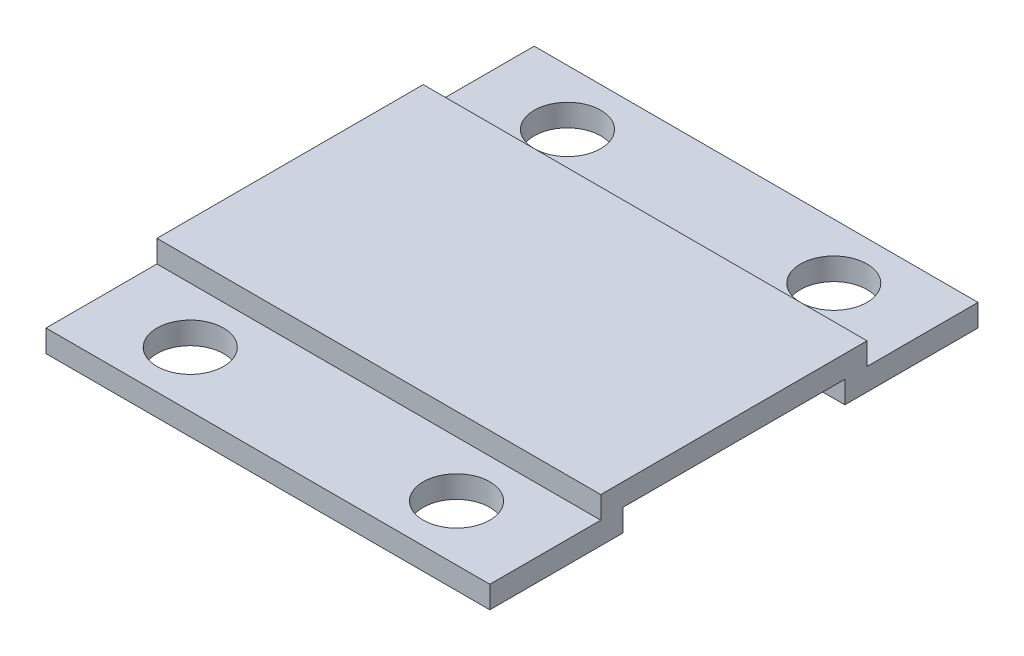
ISO-10303-21;
HEADER;
FILE_DESCRIPTION(('STEP AP214'),'2;1');
FILE_NAME('part.step','',(''),(''),'','','');
FILE_SCHEMA(('AUTOMOTIVE_DESIGN { 1 0 10303 214 1 1 1 1 }'));
ENDSEC;
DATA;
#1=APPLICATION_CONTEXT('core data for automotive mechanical design processes');
#2=APPLICATION_PROTOCOL_DEFINITION('international standard','automotive_design',2000,#1);
#3=PRODUCT_CONTEXT('',#1,'mechanical');
#4=PRODUCT('Part','Part','',(#3));
#5=PRODUCT_RELATED_PRODUCT_CATEGORY('part','',(#4));
#6=PRODUCT_DEFINITION_FORMATION('','',#4);
#7=PRODUCT_DEFINITION_CONTEXT('part definition',#1,'design');
#8=PRODUCT_DEFINITION('design','',#6,#7);
#9=PRODUCT_DEFINITION_SHAPE('','',#8);
#10=(LENGTH_UNIT() NAMED_UNIT(*) SI_UNIT(.MILLI.,.METRE.));
#11=(NAMED_UNIT(*) PLANE_ANGLE_UNIT() SI_UNIT($,.RADIAN.));
#12=(NAMED_UNIT(*) SI_UNIT($,.STERADIAN.) SOLID_ANGLE_UNIT());
#13=UNCERTAINTY_MEASURE_WITH_UNIT(LENGTH_MEASURE(1.E-05),#10,'distance_accuracy_value','');
#14=(GEOMETRIC_REPRESENTATION_CONTEXT(3) GLOBAL_UNCERTAINTY_ASSIGNED_CONTEXT((#13)) GLOBAL_UNIT_ASSIGNED_CONTEXT((#10,
#11,#12)) REPRESENTATION_CONTEXT('',''));
#15=CARTESIAN_POINT('',(0.,0.,0.));
#16=DIRECTION('',(0.,0.,1.));
#17=DIRECTION('',(1.,0.,0.));
#18=AXIS2_PLACEMENT_3D('',#15,#16,#17);
#19=CARTESIAN_POINT('',(10.,3.,6.));
#20=DIRECTION('',(0.,-1.,0.));
#21=DIRECTION('',(0.,0.,-1.));
#22=AXIS2_PLACEMENT_3D('',#19,#20,#21);
#23=PLANE('',#22);
#24=CARTESIAN_POINT('',(-6.,3.,8.5));
#25=DIRECTION('',(0.,1.,0.));
#26=DIRECTION('',(0.,0.,1.));
#27=AXIS2_PLACEMENT_3D('',#24,#25,#26);
#28=CIRCLE('',#27,1.5);
#29=CARTESIAN_POINT('',(-6.,3.,10.));
#30=VERTEX_POINT('',#29);
#31=EDGE_CURVE('E309',#30,#30,#28,.T.);
#32=ORIENTED_EDGE('',*,*,#31,.F.);
#33=EDGE_LOOP('',(#32));
#34=FACE_BOUND('',#33,.T.);
#35=CARTESIAN_POINT('',(6.,3.,8.5));
#36=DIRECTION('',(0.,1.,0.));
#37=DIRECTION('',(0.,0.,1.));
#38=AXIS2_PLACEMENT_3D('',#35,#36,#37);
#39=CIRCLE('',#38,1.5);
#40=CARTESIAN_POINT('',(6.,3.,10.));
#41=VERTEX_POINT('',#40);
#42=EDGE_CURVE('E312',#41,#41,#39,.T.);
#43=ORIENTED_EDGE('',*,*,#42,.F.);
#44=EDGE_LOOP('',(#43));
#45=FACE_BOUND('',#44,.T.);
#46=DIRECTION('',(0.,0.,1.));
#47=VECTOR('',#46,1.);
#48=CARTESIAN_POINT('',(-10.,3.,6.));
#49=LINE('',#48,#47);
#50=CARTESIAN_POINT('',(-10.,3.,6.));
#51=VERTEX_POINT('',#50);
#52=CARTESIAN_POINT('',(-10.,3.,11.));
#53=VERTEX_POINT('',#52);
#54=EDGE_CURVE('E195',#51,#53,#49,.T.);
#55=ORIENTED_EDGE('',*,*,#54,.T.);
#56=DIRECTION('',(-1.,0.,0.));
#57=VECTOR('',#56,1.);
#58=CARTESIAN_POINT('',(10.,3.,11.));
#59=LINE('',#58,#57);
#60=CARTESIAN_POINT('',(10.,3.,11.));
#61=VERTEX_POINT('',#60);
#62=EDGE_CURVE('E171',#61,#53,#59,.T.);
#63=ORIENTED_EDGE('',*,*,#62,.F.);
#64=DIRECTION('',(0.,0.,1.));
#65=VECTOR('',#64,1.);
#66=CARTESIAN_POINT('',(10.,3.,6.));
#67=LINE('',#66,#65);
#68=CARTESIAN_POINT('',(10.,3.,6.));
#69=VERTEX_POINT('',#68);
#70=EDGE_CURVE('E169',#69,#61,#67,.T.);
#71=ORIENTED_EDGE('',*,*,#70,.F.);
#72=DIRECTION('',(-1.,0.,0.));
#73=VECTOR('',#72,1.);
#74=CARTESIAN_POINT('',(10.,3.,6.));
#75=LINE('',#74,#73);
#76=EDGE_CURVE('E199',#69,#51,#75,.T.);
#77=ORIENTED_EDGE('',*,*,#76,.T.);
#78=EDGE_LOOP('',(#55,#63,#71,#77));
#79=FACE_BOUND('',#78,.T.);
#80=ADVANCED_FACE('F38',(#34,#45,#79),#23,.F.);
#81=CARTESIAN_POINT('',(10.,3.,6.));
#82=DIRECTION('',(0.,0.,-1.));
#83=DIRECTION('',(-1.,0.,0.));
#84=AXIS2_PLACEMENT_3D('',#81,#82,#83);
#85=PLANE('',#84);
#86=DIRECTION('',(0.,-1.,0.));
#87=VECTOR('',#86,1.);
#88=CARTESIAN_POINT('',(-10.,3.,6.));
#89=LINE('',#88,#87);
#90=CARTESIAN_POINT('',(-10.,4.,6.));
#91=VERTEX_POINT('',#90);
#92=EDGE_CURVE('E193',#91,#51,#89,.T.);
#93=ORIENTED_EDGE('',*,*,#92,.T.);
#94=ORIENTED_EDGE('',*,*,#76,.F.);
#95=DIRECTION('',(0.,-1.,0.));
#96=VECTOR('',#95,1.);
#97=CARTESIAN_POINT('',(10.,3.,6.));
#98=LINE('',#97,#96);
#99=CARTESIAN_POINT('',(10.,4.,6.));
#100=VERTEX_POINT('',#99);
#101=EDGE_CURVE('E167',#100,#69,#98,.T.);
#102=ORIENTED_EDGE('',*,*,#101,.F.);
#103=DIRECTION('',(-1.,0.,0.));
#104=VECTOR('',#103,1.);
#105=CARTESIAN_POINT('',(10.,4.,6.));
#106=LINE('',#105,#104);
#107=EDGE_CURVE('E202',#100,#91,#106,.T.);
#108=ORIENTED_EDGE('',*,*,#107,.T.);
#109=EDGE_LOOP('',(#93,#94,#102,#108));
#110=FACE_BOUND('',#109,.T.);
#111=ADVANCED_FACE('F268',(#110),#85,.F.);
#112=CARTESIAN_POINT('',(10.,4.,6.));
#113=DIRECTION('',(0.,-1.,0.));
#114=DIRECTION('',(0.,0.,-1.));
#115=AXIS2_PLACEMENT_3D('',#112,#113,#114);
#116=PLANE('',#115);
#117=DIRECTION('',(0.,0.,1.));
#118=VECTOR('',#117,1.);
#119=CARTESIAN_POINT('',(-10.,4.,6.));
#120=LINE('',#119,#118);
#121=CARTESIAN_POINT('',(-10.,4.,-6.));
#122=VERTEX_POINT('',#121);
#123=EDGE_CURVE('E191',#122,#91,#120,.T.);
#124=ORIENTED_EDGE('',*,*,#123,.T.);
#125=ORIENTED_EDGE('',*,*,#107,.F.);
#126=DIRECTION('',(0.,0.,1.));
#127=VECTOR('',#126,1.);
#128=CARTESIAN_POINT('',(10.,4.,6.));
#129=LINE('',#128,#127);
#130=CARTESIAN_POINT('',(10.,4.,-6.));
#131=VERTEX_POINT('',#130);
#132=EDGE_CURVE('E165',#131,#100,#129,.T.);
#133=ORIENTED_EDGE('',*,*,#132,.F.);
#134=DIRECTION('',(-1.,0.,0.));
#135=VECTOR('',#134,1.);
#136=CARTESIAN_POINT('',(10.,4.,-6.));
#137=LINE('',#136,#135);
#138=EDGE_CURVE('E205',#131,#122,#137,.T.);
#139=ORIENTED_EDGE('',*,*,#138,.T.);
#140=EDGE_LOOP('',(#124,#125,#133,#139));
#141=FACE_BOUND('',#140,.T.);
#142=ADVANCED_FACE('F272',(#141),#116,.F.);
#143=CARTESIAN_POINT('',(10.,4.,-6.));
#144=DIRECTION('',(0.,0.,1.));
#145=DIRECTION('',(1.,0.,0.));
#146=AXIS2_PLACEMENT_3D('',#143,#144,#145);
#147=PLANE('',#146);
#148=DIRECTION('',(0.,1.,0.));
#149=VECTOR('',#148,1.);
#150=CARTESIAN_POINT('',(-10.,4.,-6.));
#151=LINE('',#150,#149);
#152=CARTESIAN_POINT('',(-10.,3.,-6.));
#153=VERTEX_POINT('',#152);
#154=EDGE_CURVE('E189',#153,#122,#151,.T.);
#155=ORIENTED_EDGE('',*,*,#154,.T.);
#156=ORIENTED_EDGE('',*,*,#138,.F.);
#157=DIRECTION('',(0.,1.,0.));
#158=VECTOR('',#157,1.);
#159=CARTESIAN_POINT('',(10.,4.,-6.));
#160=LINE('',#159,#158);
#161=CARTESIAN_POINT('',(10.,3.,-6.));
#162=VERTEX_POINT('',#161);
#163=EDGE_CURVE('E163',#162,#131,#160,.T.);
#164=ORIENTED_EDGE('',*,*,#163,.F.);
#165=DIRECTION('',(-1.,0.,0.));
#166=VECTOR('',#165,1.);
#167=CARTESIAN_POINT('',(10.,3.,-6.));
#168=LINE('',#167,#166);
#169=EDGE_CURVE('E208',#162,#153,#168,.T.);
#170=ORIENTED_EDGE('',*,*,#169,.T.);
#171=EDGE_LOOP('',(#155,#156,#164,#170));
#172=FACE_BOUND('',#171,.T.);
#173=ADVANCED_FACE('F276',(#172),#147,.F.);
#174=CARTESIAN_POINT('',(10.,3.,-11.));
#175=DIRECTION('',(0.,-1.,0.));
#176=DIRECTION('',(0.,0.,-1.));
#177=AXIS2_PLACEMENT_3D('',#174,#175,#176);
#178=PLANE('',#177);
#179=CARTESIAN_POINT('',(6.,3.,-8.5));
#180=DIRECTION('',(0.,1.,0.));
#181=DIRECTION('',(0.,0.,1.));
#182=AXIS2_PLACEMENT_3D('',#179,#180,#181);
#183=CIRCLE('',#182,1.5);
#184=CARTESIAN_POINT('',(6.,3.,-7.));
#185=VERTEX_POINT('',#184);
#186=EDGE_CURVE('E308',#185,#185,#183,.T.);
#187=ORIENTED_EDGE('',*,*,#186,.F.);
#188=EDGE_LOOP('',(#187));
#189=FACE_BOUND('',#188,.T.);
#190=CARTESIAN_POINT('',(-6.,3.,-8.5));
#191=DIRECTION('',(0.,1.,0.));
#192=DIRECTION('',(0.,0.,1.));
#193=AXIS2_PLACEMENT_3D('',#190,#191,#192);
#194=CIRCLE('',#193,1.5);
#195=CARTESIAN_POINT('',(-6.,3.,-7.));
#196=VERTEX_POINT('',#195);
#197=EDGE_CURVE('E175',#196,#196,#194,.T.);
#198=ORIENTED_EDGE('',*,*,#197,.F.);
#199=EDGE_LOOP('',(#198));
#200=FACE_BOUND('',#199,.T.);
#201=DIRECTION('',(0.,0.,1.));
#202=VECTOR('',#201,1.);
#203=CARTESIAN_POINT('',(-10.,3.,-11.));
#204=LINE('',#203,#202);
#205=CARTESIAN_POINT('',(-10.,3.,-11.));
#206=VERTEX_POINT('',#205);
#207=EDGE_CURVE('E187',#206,#153,#204,.T.);
#208=ORIENTED_EDGE('',*,*,#207,.T.);
#209=ORIENTED_EDGE('',*,*,#169,.F.);
#210=DIRECTION('',(0.,0.,1.));
#211=VECTOR('',#210,1.);
#212=CARTESIAN_POINT('',(10.,3.,-11.));
#213=LINE('',#212,#211);
#214=CARTESIAN_POINT('',(10.,3.,-11.));
#215=VERTEX_POINT('',#214);
#216=EDGE_CURVE('E161',#215,#162,#213,.T.);
#217=ORIENTED_EDGE('',*,*,#216,.F.);
#218=DIRECTION('',(-1.,0.,0.));
#219=VECTOR('',#218,1.);
#220=CARTESIAN_POINT('',(10.,3.,-11.));
#221=LINE('',#220,#219);
#222=EDGE_CURVE('E211',#215,#206,#221,.T.);
#223=ORIENTED_EDGE('',*,*,#222,.T.);
#224=EDGE_LOOP('',(#208,#209,#217,#223));
#225=FACE_BOUND('',#224,.T.);
#226=ADVANCED_FACE('F280',(#189,#200,#225),#178,.F.);
#227=CARTESIAN_POINT('',(10.,2.,-11.));
#228=DIRECTION('',(0.,0.,1.));
#229=DIRECTION('',(0.,-1.,0.));
#230=AXIS2_PLACEMENT_3D('',#227,#228,#229);
#231=PLANE('',#230);
#232=DIRECTION('',(0.,1.,0.));
#233=VECTOR('',#232,1.);
#234=CARTESIAN_POINT('',(-10.,2.,-11.));
#235=LINE('',#234,#233);
#236=CARTESIAN_POINT('',(-10.,2.,-11.));
#237=VERTEX_POINT('',#236);
#238=EDGE_CURVE('E185',#237,#206,#235,.T.);
#239=ORIENTED_EDGE('',*,*,#238,.T.);
#240=ORIENTED_EDGE('',*,*,#222,.F.);
#241=DIRECTION('',(0.,1.,0.));
#242=VECTOR('',#241,1.);
#243=CARTESIAN_POINT('',(10.,2.,-11.));
#244=LINE('',#243,#242);
#245=CARTESIAN_POINT('',(10.,2.,-11.));
#246=VERTEX_POINT('',#245);
#247=EDGE_CURVE('E154',#246,#215,#244,.T.);
#248=ORIENTED_EDGE('',*,*,#247,.F.);
#249=DIRECTION('',(-1.,0.,0.));
#250=VECTOR('',#249,1.);
#251=CARTESIAN_POINT('',(10.,2.,-11.));
#252=LINE('',#251,#250);
#253=EDGE_CURVE('E214',#246,#237,#252,.T.);
#254=ORIENTED_EDGE('',*,*,#253,.T.);
#255=EDGE_LOOP('',(#239,#240,#248,#254));
#256=FACE_BOUND('',#255,.T.);
#257=ADVANCED_FACE('F284',(#256),#231,.F.);
#258=CARTESIAN_POINT('',(10.,4.,-5.));
#259=DIRECTION('',(0.,0.,1.));
#260=DIRECTION('',(1.,0.,0.));
#261=AXIS2_PLACEMENT_3D('',#258,#259,#260);
#262=PLANE('',#261);
#263=DIRECTION('',(0.,1.,0.));
#264=VECTOR('',#263,1.);
#265=CARTESIAN_POINT('',(-10.,4.,-5.));
#266=LINE('',#265,#264);
#267=CARTESIAN_POINT('',(-10.,2.,-5.));
#268=VERTEX_POINT('',#267);
#269=CARTESIAN_POINT('',(-10.,3.,-5.));
#270=VERTEX_POINT('',#269);
#271=EDGE_CURVE('E180',#268,#270,#266,.T.);
#272=ORIENTED_EDGE('',*,*,#271,.F.);
#273=DIRECTION('',(-1.,0.,0.));
#274=VECTOR('',#273,1.);
#275=CARTESIAN_POINT('',(10.,2.,-5.));
#276=LINE('',#275,#274);
#277=CARTESIAN_POINT('',(10.,2.,-5.));
#278=VERTEX_POINT('',#277);
#279=EDGE_CURVE('E159',#278,#268,#276,.T.);
#280=ORIENTED_EDGE('',*,*,#279,.F.);
#281=DIRECTION('',(0.,1.,0.));
#282=VECTOR('',#281,1.);
#283=CARTESIAN_POINT('',(10.,4.,-5.));
#284=LINE('',#283,#282);
#285=CARTESIAN_POINT('',(10.,3.,-5.));
#286=VERTEX_POINT('',#285);
#287=EDGE_CURVE('E152',#278,#286,#284,.T.);
#288=ORIENTED_EDGE('',*,*,#287,.T.);
#289=DIRECTION('',(-1.,0.,0.));
#290=VECTOR('',#289,1.);
#291=CARTESIAN_POINT('',(10.,3.,-5.));
#292=LINE('',#291,#290);
#293=EDGE_CURVE('E140',#286,#270,#292,.T.);
#294=ORIENTED_EDGE('',*,*,#293,.T.);
#295=EDGE_LOOP('',(#272,#280,#288,#294));
#296=FACE_BOUND('',#295,.T.);
#297=ADVANCED_FACE('F288',(#296),#262,.T.);
#298=CARTESIAN_POINT('',(10.,3.,6.));
#299=DIRECTION('',(0.,-1.,0.));
#300=DIRECTION('',(0.,0.,-1.));
#301=AXIS2_PLACEMENT_3D('',#298,#299,#300);
#302=PLANE('',#301);
#303=DIRECTION('',(0.,0.,-1.));
#304=VECTOR('',#303,1.);
#305=CARTESIAN_POINT('',(-10.,3.,6.));
#306=LINE('',#305,#304);
#307=CARTESIAN_POINT('',(-10.,3.,5.));
#308=VERTEX_POINT('',#307);
#309=EDGE_CURVE('E178',#270,#308,#306,.F.);
#310=ORIENTED_EDGE('',*,*,#309,.F.);
#311=ORIENTED_EDGE('',*,*,#293,.F.);
#312=DIRECTION('',(0.,0.,-1.));
#313=VECTOR('',#312,1.);
#314=CARTESIAN_POINT('',(10.,3.,6.));
#315=LINE('',#314,#313);
#316=CARTESIAN_POINT('',(10.,3.,5.));
#317=VERTEX_POINT('',#316);
#318=EDGE_CURVE('E147',#286,#317,#315,.F.);
#319=ORIENTED_EDGE('',*,*,#318,.T.);
#320=DIRECTION('',(-1.,0.,0.));
#321=VECTOR('',#320,1.);
#322=CARTESIAN_POINT('',(10.,3.,5.));
#323=LINE('',#322,#321);
#324=EDGE_CURVE('E130',#317,#308,#323,.T.);
#325=ORIENTED_EDGE('',*,*,#324,.T.);
#326=EDGE_LOOP('',(#310,#311,#319,#325));
#327=FACE_BOUND('',#326,.T.);
#328=ADVANCED_FACE('F151',(#327),#302,.T.);
#329=CARTESIAN_POINT('',(10.,3.,5.));
#330=DIRECTION('',(0.,0.,-1.));
#331=DIRECTION('',(-1.,0.,0.));
#332=AXIS2_PLACEMENT_3D('',#329,#330,#331);
#333=PLANE('',#332);
#334=DIRECTION('',(0.,1.,0.));
#335=VECTOR('',#334,1.);
#336=CARTESIAN_POINT('',(-10.,3.,5.));
#337=LINE('',#336,#335);
#338=CARTESIAN_POINT('',(-10.,2.,5.));
#339=VERTEX_POINT('',#338);
#340=EDGE_CURVE('E135',#308,#339,#337,.F.);
#341=ORIENTED_EDGE('',*,*,#340,.F.);
#342=ORIENTED_EDGE('',*,*,#324,.F.);
#343=DIRECTION('',(0.,1.,0.));
#344=VECTOR('',#343,1.);
#345=CARTESIAN_POINT('',(10.,3.,5.));
#346=LINE('',#345,#344);
#347=CARTESIAN_POINT('',(10.,2.,5.));
#348=VERTEX_POINT('',#347);
#349=EDGE_CURVE('E133',#317,#348,#346,.F.);
#350=ORIENTED_EDGE('',*,*,#349,.T.);
#351=DIRECTION('',(-1.,0.,0.));
#352=VECTOR('',#351,1.);
#353=CARTESIAN_POINT('',(10.,2.,5.));
#354=LINE('',#353,#352);
#355=EDGE_CURVE('E61',#348,#339,#354,.T.);
#356=ORIENTED_EDGE('',*,*,#355,.T.);
#357=EDGE_LOOP('',(#341,#342,#350,#356));
#358=FACE_BOUND('',#357,.T.);
#359=ADVANCED_FACE('F132',(#358),#333,.T.);
#360=CARTESIAN_POINT('',(10.,3.,11.));
#361=DIRECTION('',(0.,0.,-1.));
#362=DIRECTION('',(0.,1.,0.));
#363=AXIS2_PLACEMENT_3D('',#360,#361,#362);
#364=PLANE('',#363);
#365=DIRECTION('',(0.,-1.,0.));
#366=VECTOR('',#365,1.);
#367=CARTESIAN_POINT('',(-10.,3.,11.));
#368=LINE('',#367,#366);
#369=CARTESIAN_POINT('',(-10.,2.,11.));
#370=VERTEX_POINT('',#369);
#371=EDGE_CURVE('E172',#53,#370,#368,.T.);
#372=ORIENTED_EDGE('',*,*,#371,.T.);
#373=DIRECTION('',(-1.,0.,0.));
#374=VECTOR('',#373,1.);
#375=CARTESIAN_POINT('',(10.,2.,11.));
#376=LINE('',#375,#374);
#377=CARTESIAN_POINT('',(10.,2.,11.));
#378=VERTEX_POINT('',#377);
#379=EDGE_CURVE('E55',#378,#370,#376,.T.);
#380=ORIENTED_EDGE('',*,*,#379,.F.);
#381=DIRECTION('',(0.,-1.,0.));
#382=VECTOR('',#381,1.);
#383=CARTESIAN_POINT('',(10.,3.,11.));
#384=LINE('',#383,#382);
#385=EDGE_CURVE('E149',#61,#378,#384,.T.);
#386=ORIENTED_EDGE('',*,*,#385,.F.);
#387=ORIENTED_EDGE('',*,*,#62,.T.);
#388=EDGE_LOOP('',(#372,#380,#386,#387));
#389=FACE_BOUND('',#388,.T.);
#390=ADVANCED_FACE('F262',(#389),#364,.F.);
#391=CARTESIAN_POINT('',(10.,0.,0.));
#392=DIRECTION('',(-1.,0.,0.));
#393=DIRECTION('',(0.,0.,1.));
#394=AXIS2_PLACEMENT_3D('',#391,#392,#393);
#395=PLANE('',#394);
#396=ORIENTED_EDGE('',*,*,#385,.T.);
#397=DIRECTION('',(0.,0.,1.));
#398=VECTOR('',#397,1.);
#399=CARTESIAN_POINT('',(10.,2.,10.));
#400=LINE('',#399,#398);
#401=EDGE_CURVE('E11',#348,#378,#400,.T.);
#402=ORIENTED_EDGE('',*,*,#401,.F.);
#403=ORIENTED_EDGE('',*,*,#349,.F.);
#404=ORIENTED_EDGE('',*,*,#318,.F.);
#405=ORIENTED_EDGE('',*,*,#287,.F.);
#406=DIRECTION('',(0.,0.,1.));
#407=VECTOR('',#406,1.);
#408=CARTESIAN_POINT('',(10.,2.,-11.));
#409=LINE('',#408,#407);
#410=EDGE_CURVE('E47',#246,#278,#409,.T.);
#411=ORIENTED_EDGE('',*,*,#410,.F.);
#412=ORIENTED_EDGE('',*,*,#247,.T.);
#413=ORIENTED_EDGE('',*,*,#216,.T.);
#414=ORIENTED_EDGE('',*,*,#163,.T.);
#415=ORIENTED_EDGE('',*,*,#132,.T.);
#416=ORIENTED_EDGE('',*,*,#101,.T.);
#417=ORIENTED_EDGE('',*,*,#70,.T.);
#418=EDGE_LOOP('',(#396,#402,#403,#404,#405,#411,#412,#413,#414,#415,#416,#417));
#419=FACE_BOUND('',#418,.T.);
#420=ADVANCED_FACE('F145',(#419),#395,.F.);
#421=CARTESIAN_POINT('',(-10.,0.,0.));
#422=DIRECTION('',(-1.,0.,0.));
#423=DIRECTION('',(0.,0.,1.));
#424=AXIS2_PLACEMENT_3D('',#421,#422,#423);
#425=PLANE('',#424);
#426=ORIENTED_EDGE('',*,*,#371,.F.);
#427=ORIENTED_EDGE('',*,*,#54,.F.);
#428=ORIENTED_EDGE('',*,*,#92,.F.);
#429=ORIENTED_EDGE('',*,*,#123,.F.);
#430=ORIENTED_EDGE('',*,*,#154,.F.);
#431=ORIENTED_EDGE('',*,*,#207,.F.);
#432=ORIENTED_EDGE('',*,*,#238,.F.);
#433=DIRECTION('',(0.,0.,1.));
#434=VECTOR('',#433,1.);
#435=CARTESIAN_POINT('',(-10.,2.,-11.));
#436=LINE('',#435,#434);
#437=EDGE_CURVE('E183',#237,#268,#436,.T.);
#438=ORIENTED_EDGE('',*,*,#437,.T.);
#439=ORIENTED_EDGE('',*,*,#271,.T.);
#440=ORIENTED_EDGE('',*,*,#309,.T.);
#441=ORIENTED_EDGE('',*,*,#340,.T.);
#442=DIRECTION('',(0.,0.,1.));
#443=VECTOR('',#442,1.);
#444=CARTESIAN_POINT('',(-10.,2.,6.));
#445=LINE('',#444,#443);
#446=EDGE_CURVE('E174',#339,#370,#445,.T.);
#447=ORIENTED_EDGE('',*,*,#446,.T.);
#448=EDGE_LOOP('',(#426,#427,#428,#429,#430,#431,#432,#438,#439,#440,#441,#447));
#449=FACE_BOUND('',#448,.T.);
#450=ADVANCED_FACE('F261',(#449),#425,.T.);
#451=CARTESIAN_POINT('',(6.,-4.24264068711929,8.5));
#452=DIRECTION('',(0.,1.,0.));
#453=DIRECTION('',(0.,0.,1.));
#454=AXIS2_PLACEMENT_3D('',#451,#452,#453);
#455=CYLINDRICAL_SURFACE('',#454,1.5);
#456=CARTESIAN_POINT('',(6.,2.,8.5));
#457=DIRECTION('',(0.,1.,0.));
#458=DIRECTION('',(0.,0.,1.));
#459=AXIS2_PLACEMENT_3D('',#456,#457,#458);
#460=CIRCLE('',#459,1.5);
#461=CARTESIAN_POINT('',(6.,2.,10.));
#462=VERTEX_POINT('',#461);
#463=EDGE_CURVE('E42',#462,#462,#460,.F.);
#464=ORIENTED_EDGE('',*,*,#463,.T.);
#465=EDGE_LOOP('',(#464));
#466=FACE_BOUND('',#465,.T.);
#467=ORIENTED_EDGE('',*,*,#42,.T.);
#468=EDGE_LOOP('',(#467));
#469=FACE_BOUND('',#468,.T.);
#470=ADVANCED_FACE('F233',(#466,#469),#455,.F.);
#471=CARTESIAN_POINT('',(-6.,-4.24264068711929,8.5));
#472=DIRECTION('',(0.,1.,0.));
#473=DIRECTION('',(0.,0.,1.));
#474=AXIS2_PLACEMENT_3D('',#471,#472,#473);
#475=CYLINDRICAL_SURFACE('',#474,1.5);
#476=CARTESIAN_POINT('',(-6.,2.,8.5));
#477=DIRECTION('',(0.,1.,0.));
#478=DIRECTION('',(0.,0.,1.));
#479=AXIS2_PLACEMENT_3D('',#476,#477,#478);
#480=CIRCLE('',#479,1.5);
#481=CARTESIAN_POINT('',(-6.,2.,10.));
#482=VERTEX_POINT('',#481);
#483=EDGE_CURVE('E226',#482,#482,#480,.F.);
#484=ORIENTED_EDGE('',*,*,#483,.T.);
#485=EDGE_LOOP('',(#484));
#486=FACE_BOUND('',#485,.T.);
#487=ORIENTED_EDGE('',*,*,#31,.T.);
#488=EDGE_LOOP('',(#487));
#489=FACE_BOUND('',#488,.T.);
#490=ADVANCED_FACE('F251',(#486,#489),#475,.F.);
#491=CARTESIAN_POINT('',(-6.,-4.24264068711929,-8.5));
#492=DIRECTION('',(0.,1.,0.));
#493=DIRECTION('',(0.,0.,1.));
#494=AXIS2_PLACEMENT_3D('',#491,#492,#493);
#495=CYLINDRICAL_SURFACE('',#494,1.5);
#496=CARTESIAN_POINT('',(-6.,2.,-8.5));
#497=DIRECTION('',(0.,1.,0.));
#498=DIRECTION('',(0.,0.,1.));
#499=AXIS2_PLACEMENT_3D('',#496,#497,#498);
#500=CIRCLE('',#499,1.5);
#501=CARTESIAN_POINT('',(-6.,2.,-7.));
#502=VERTEX_POINT('',#501);
#503=EDGE_CURVE('E224',#502,#502,#500,.F.);
#504=ORIENTED_EDGE('',*,*,#503,.T.);
#505=EDGE_LOOP('',(#504));
#506=FACE_BOUND('',#505,.T.);
#507=ORIENTED_EDGE('',*,*,#197,.T.);
#508=EDGE_LOOP('',(#507));
#509=FACE_BOUND('',#508,.T.);
#510=ADVANCED_FACE('F245',(#506,#509),#495,.F.);
#511=CARTESIAN_POINT('',(6.,-4.24264068711929,-8.5));
#512=DIRECTION('',(0.,1.,0.));
#513=DIRECTION('',(0.,0.,1.));
#514=AXIS2_PLACEMENT_3D('',#511,#512,#513);
#515=CYLINDRICAL_SURFACE('',#514,1.5);
#516=CARTESIAN_POINT('',(6.,2.,-8.5));
#517=DIRECTION('',(0.,1.,0.));
#518=DIRECTION('',(0.,0.,1.));
#519=AXIS2_PLACEMENT_3D('',#516,#517,#518);
#520=CIRCLE('',#519,1.5);
#521=CARTESIAN_POINT('',(6.,2.,-7.));
#522=VERTEX_POINT('',#521);
#523=EDGE_CURVE('E220',#522,#522,#520,.F.);
#524=ORIENTED_EDGE('',*,*,#523,.T.);
#525=EDGE_LOOP('',(#524));
#526=FACE_BOUND('',#525,.T.);
#527=ORIENTED_EDGE('',*,*,#186,.T.);
#528=EDGE_LOOP('',(#527));
#529=FACE_BOUND('',#528,.T.);
#530=ADVANCED_FACE('F239',(#526,#529),#515,.F.);
#531=CARTESIAN_POINT('',(110.,2.,-15.));
#532=DIRECTION('',(0.,1.,0.));
#533=DIRECTION('',(0.,0.,1.));
#534=AXIS2_PLACEMENT_3D('',#531,#532,#533);
#535=PLANE('',#534);
#536=ORIENTED_EDGE('',*,*,#410,.T.);
#537=ORIENTED_EDGE('',*,*,#279,.T.);
#538=ORIENTED_EDGE('',*,*,#437,.F.);
#539=ORIENTED_EDGE('',*,*,#253,.F.);
#540=EDGE_LOOP('',(#536,#537,#538,#539));
#541=FACE_BOUND('',#540,.T.);
#542=ORIENTED_EDGE('',*,*,#523,.F.);
#543=EDGE_LOOP('',(#542));
#544=FACE_BOUND('',#543,.T.);
#545=ORIENTED_EDGE('',*,*,#503,.F.);
#546=EDGE_LOOP('',(#545));
#547=FACE_BOUND('',#546,.T.);
#548=ADVANCED_FACE('F238',(#541,#544,#547),#535,.F.);
#549=ORIENTED_EDGE('',*,*,#401,.T.);
#550=ORIENTED_EDGE('',*,*,#379,.T.);
#551=ORIENTED_EDGE('',*,*,#446,.F.);
#552=ORIENTED_EDGE('',*,*,#355,.F.);
#553=EDGE_LOOP('',(#549,#550,#551,#552));
#554=FACE_BOUND('',#553,.T.);
#555=ORIENTED_EDGE('',*,*,#463,.F.);
#556=EDGE_LOOP('',(#555));
#557=FACE_BOUND('',#556,.T.);
#558=ORIENTED_EDGE('',*,*,#483,.F.);
#559=EDGE_LOOP('',(#558));
#560=FACE_BOUND('',#559,.T.);
#561=ADVANCED_FACE('F40',(#554,#557,#560),#535,.F.);
#562=CLOSED_SHELL('',(#80,#111,#142,#173,#226,#257,#297,#328,#359,#390,#420,#450,#470,#490,#510,
#530,#548,#561));
#563=MANIFOLD_SOLID_BREP('B2',#562);
#564=ADVANCED_BREP_SHAPE_REPRESENTATION('',(#18,#563),#14);
#565=SHAPE_DEFINITION_REPRESENTATION(#9,#564);
ENDSEC;
END-ISO-10303-21;
